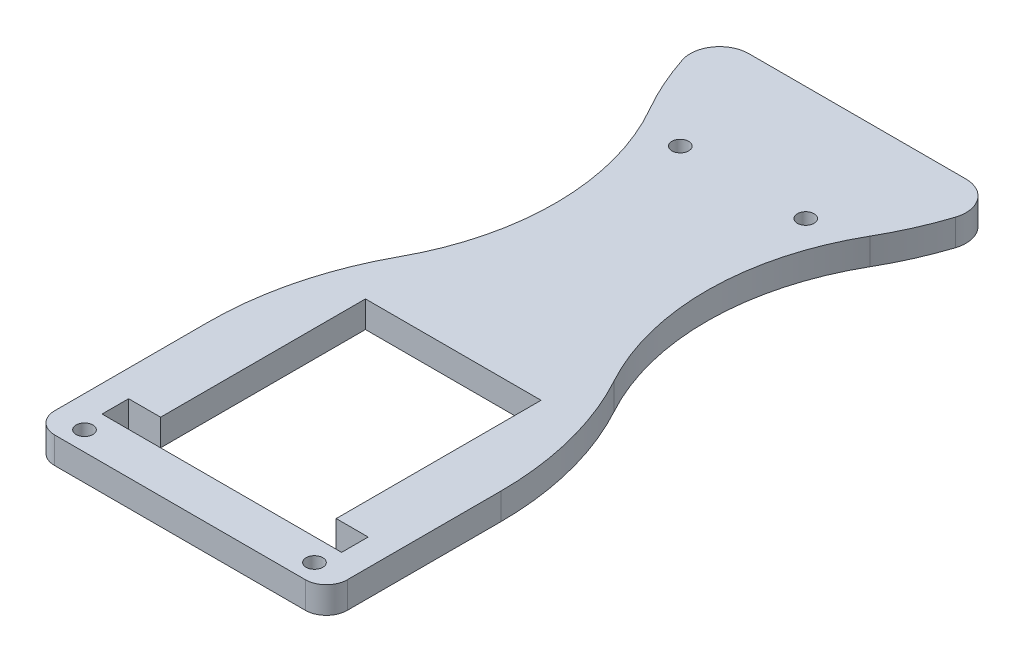
ISO-10303-21;
HEADER;
FILE_DESCRIPTION(('STEP AP214'),'2;1');
FILE_NAME('part.step','',(''),(''),'','','');
FILE_SCHEMA(('AUTOMOTIVE_DESIGN { 1 0 10303 214 1 1 1 1 }'));
ENDSEC;
DATA;
#1=APPLICATION_CONTEXT('core data for automotive mechanical design processes');
#2=APPLICATION_PROTOCOL_DEFINITION('international standard','automotive_design',2000,#1);
#3=PRODUCT_CONTEXT('',#1,'mechanical');
#4=PRODUCT('Part','Part','',(#3));
#5=PRODUCT_RELATED_PRODUCT_CATEGORY('part','',(#4));
#6=PRODUCT_DEFINITION_FORMATION('','',#4);
#7=PRODUCT_DEFINITION_CONTEXT('part definition',#1,'design');
#8=PRODUCT_DEFINITION('design','',#6,#7);
#9=PRODUCT_DEFINITION_SHAPE('','',#8);
#10=(LENGTH_UNIT() NAMED_UNIT(*) SI_UNIT(.MILLI.,.METRE.));
#11=(NAMED_UNIT(*) PLANE_ANGLE_UNIT() SI_UNIT($,.RADIAN.));
#12=(NAMED_UNIT(*) SI_UNIT($,.STERADIAN.) SOLID_ANGLE_UNIT());
#13=UNCERTAINTY_MEASURE_WITH_UNIT(LENGTH_MEASURE(1.E-05),#10,'distance_accuracy_value','');
#14=(GEOMETRIC_REPRESENTATION_CONTEXT(3) GLOBAL_UNCERTAINTY_ASSIGNED_CONTEXT((#13)) GLOBAL_UNIT_ASSIGNED_CONTEXT((#10,
#11,#12)) REPRESENTATION_CONTEXT('',''));
#15=CARTESIAN_POINT('',(0.,0.,0.));
#16=DIRECTION('',(0.,0.,1.));
#17=DIRECTION('',(1.,0.,0.));
#18=AXIS2_PLACEMENT_3D('',#15,#16,#17);
#19=CARTESIAN_POINT('',(0.,3.175,0.));
#20=DIRECTION('',(0.,1.,0.));
#21=DIRECTION('',(0.,0.,1.));
#22=AXIS2_PLACEMENT_3D('',#19,#20,#21);
#23=PLANE('',#22);
#24=CARTESIAN_POINT('',(27.5,3.175,195.35));
#25=DIRECTION('',(0.,1.,0.));
#26=DIRECTION('',(0.,0.,1.));
#27=AXIS2_PLACEMENT_3D('',#24,#25,#26);
#28=CIRCLE('',#27,2.00000000000001);
#29=CARTESIAN_POINT('',(27.5,3.175,197.35));
#30=VERTEX_POINT('',#29);
#31=EDGE_CURVE('E463',#30,#30,#28,.T.);
#32=ORIENTED_EDGE('',*,*,#31,.F.);
#33=EDGE_LOOP('',(#32));
#34=FACE_BOUND('',#33,.T.);
#35=CARTESIAN_POINT('',(-15.,3.175,65.3500000000001));
#36=DIRECTION('',(0.,1.,0.));
#37=DIRECTION('',(0.,0.,1.));
#38=AXIS2_PLACEMENT_3D('',#35,#36,#37);
#39=CIRCLE('',#38,2.);
#40=CARTESIAN_POINT('',(-15.,3.175,67.3500000000001));
#41=VERTEX_POINT('',#40);
#42=EDGE_CURVE('E447',#41,#41,#39,.T.);
#43=ORIENTED_EDGE('',*,*,#42,.F.);
#44=EDGE_LOOP('',(#43));
#45=FACE_BOUND('',#44,.T.);
#46=CARTESIAN_POINT('',(15.,3.175,65.3500000000001));
#47=DIRECTION('',(0.,1.,0.));
#48=DIRECTION('',(0.,0.,1.));
#49=AXIS2_PLACEMENT_3D('',#46,#47,#48);
#50=CIRCLE('',#49,2.00000000000001);
#51=CARTESIAN_POINT('',(15.,3.175,67.3500000000001));
#52=VERTEX_POINT('',#51);
#53=EDGE_CURVE('E228',#52,#52,#50,.T.);
#54=ORIENTED_EDGE('',*,*,#53,.F.);
#55=EDGE_LOOP('',(#54));
#56=FACE_BOUND('',#55,.T.);
#57=CARTESIAN_POINT('',(-27.5,3.175,195.35));
#58=DIRECTION('',(0.,1.,0.));
#59=DIRECTION('',(0.,0.,1.));
#60=AXIS2_PLACEMENT_3D('',#57,#58,#59);
#61=CIRCLE('',#60,2.00000000000001);
#62=CARTESIAN_POINT('',(-27.5,3.175,197.35));
#63=VERTEX_POINT('',#62);
#64=EDGE_CURVE('E474',#63,#63,#61,.T.);
#65=ORIENTED_EDGE('',*,*,#64,.F.);
#66=EDGE_LOOP('',(#65));
#67=FACE_BOUND('',#66,.T.);
#68=DIRECTION('',(-1.,0.,0.));
#69=VECTOR('',#68,1.);
#70=CARTESIAN_POINT('',(0.,3.175,183.65));
#71=LINE('',#70,#69);
#72=CARTESIAN_POINT('',(-21.,3.175,183.65));
#73=VERTEX_POINT('',#72);
#74=CARTESIAN_POINT('',(-28.65,3.175,183.65));
#75=VERTEX_POINT('',#74);
#76=EDGE_CURVE('E250',#73,#75,#71,.T.);
#77=ORIENTED_EDGE('',*,*,#76,.F.);
#78=DIRECTION('',(0.,0.,-1.));
#79=VECTOR('',#78,1.);
#80=CARTESIAN_POINT('',(-21.,3.175,0.));
#81=LINE('',#80,#79);
#82=CARTESIAN_POINT('',(-21.,3.175,134.65));
#83=VERTEX_POINT('',#82);
#84=EDGE_CURVE('E198',#73,#83,#81,.T.);
#85=ORIENTED_EDGE('',*,*,#84,.T.);
#86=DIRECTION('',(-1.,0.,0.));
#87=VECTOR('',#86,1.);
#88=CARTESIAN_POINT('',(0.,3.175,134.65));
#89=LINE('',#88,#87);
#90=CARTESIAN_POINT('',(21.,3.175,134.65));
#91=VERTEX_POINT('',#90);
#92=EDGE_CURVE('E221',#91,#83,#89,.T.);
#93=ORIENTED_EDGE('',*,*,#92,.F.);
#94=DIRECTION('',(0.,0.,-1.));
#95=VECTOR('',#94,1.);
#96=CARTESIAN_POINT('',(21.,3.175,0.));
#97=LINE('',#96,#95);
#98=CARTESIAN_POINT('',(21.,3.175,183.65));
#99=VERTEX_POINT('',#98);
#100=EDGE_CURVE('E225',#99,#91,#97,.T.);
#101=ORIENTED_EDGE('',*,*,#100,.F.);
#102=DIRECTION('',(1.,0.,0.));
#103=VECTOR('',#102,1.);
#104=CARTESIAN_POINT('',(0.,3.175,183.65));
#105=LINE('',#104,#103);
#106=CARTESIAN_POINT('',(28.65,3.175,183.65));
#107=VERTEX_POINT('',#106);
#108=EDGE_CURVE('E266',#99,#107,#105,.T.);
#109=ORIENTED_EDGE('',*,*,#108,.T.);
#110=DIRECTION('',(0.,0.,-1.));
#111=VECTOR('',#110,1.);
#112=CARTESIAN_POINT('',(28.65,3.175,0.));
#113=LINE('',#112,#111);
#114=CARTESIAN_POINT('',(28.65,3.175,190.));
#115=VERTEX_POINT('',#114);
#116=EDGE_CURVE('E262',#115,#107,#113,.T.);
#117=ORIENTED_EDGE('',*,*,#116,.F.);
#118=DIRECTION('',(-1.,0.,0.));
#119=VECTOR('',#118,1.);
#120=CARTESIAN_POINT('',(0.,3.175,190.));
#121=LINE('',#120,#119);
#122=CARTESIAN_POINT('',(-28.65,3.175,190.));
#123=VERTEX_POINT('',#122);
#124=EDGE_CURVE('E258',#115,#123,#121,.T.);
#125=ORIENTED_EDGE('',*,*,#124,.T.);
#126=DIRECTION('',(0.,0.,-1.));
#127=VECTOR('',#126,1.);
#128=CARTESIAN_POINT('',(-28.65,3.175,0.));
#129=LINE('',#128,#127);
#130=EDGE_CURVE('E254',#123,#75,#129,.T.);
#131=ORIENTED_EDGE('',*,*,#130,.T.);
#132=EDGE_LOOP('',(#77,#85,#93,#101,#109,#117,#125,#131));
#133=FACE_BOUND('',#132,.T.);
#134=CARTESIAN_POINT('',(-39.608915366642,3.175,23.5255484451654));
#135=DIRECTION('',(0.,1.,0.));
#136=DIRECTION('',(0.,0.,1.));
#137=AXIS2_PLACEMENT_3D('',#134,#135,#136);
#138=CIRCLE('',#137,76.);
#139=CARTESIAN_POINT('',(26.311818964941,3.175,61.3469284462291));
#140=VERTEX_POINT('',#139);
#141=CARTESIAN_POINT('',(32.6166665782042,3.175,47.1785675490412));
#142=VERTEX_POINT('',#141);
#143=EDGE_CURVE('E366',#140,#142,#138,.T.);
#144=ORIENTED_EDGE('',*,*,#143,.T.);
#145=CARTESIAN_POINT('',(25.964310346442,3.175,45.));
#146=DIRECTION('',(0.,1.,0.));
#147=DIRECTION('',(0.,0.,1.));
#148=AXIS2_PLACEMENT_3D('',#145,#146,#147);
#149=CIRCLE('',#148,7.);
#150=CARTESIAN_POINT('',(25.964310346442,3.175,38.));
#151=VERTEX_POINT('',#150);
#152=EDGE_CURVE('E403',#142,#151,#149,.T.);
#153=ORIENTED_EDGE('',*,*,#152,.T.);
#154=DIRECTION('',(-1.,0.,0.));
#155=VECTOR('',#154,1.);
#156=CARTESIAN_POINT('',(0.,3.175,38.));
#157=LINE('',#156,#155);
#158=CARTESIAN_POINT('',(-25.9643103464421,3.175,38.));
#159=VERTEX_POINT('',#158);
#160=EDGE_CURVE('E276',#151,#159,#157,.T.);
#161=ORIENTED_EDGE('',*,*,#160,.T.);
#162=CARTESIAN_POINT('',(-25.964310346442,3.175,45.));
#163=DIRECTION('',(0.,1.,0.));
#164=DIRECTION('',(0.,0.,1.));
#165=AXIS2_PLACEMENT_3D('',#162,#163,#164);
#166=CIRCLE('',#165,7.);
#167=CARTESIAN_POINT('',(-32.6166665782042,3.175,47.1785675490412));
#168=VERTEX_POINT('',#167);
#169=EDGE_CURVE('E400',#159,#168,#166,.T.);
#170=ORIENTED_EDGE('',*,*,#169,.T.);
#171=CARTESIAN_POINT('',(39.608915366642,3.175,23.5255484451655));
#172=DIRECTION('',(0.,1.,0.));
#173=DIRECTION('',(0.,0.,1.));
#174=AXIS2_PLACEMENT_3D('',#171,#172,#173);
#175=CIRCLE('',#174,76.);
#176=CARTESIAN_POINT('',(-26.311818964941,3.175,61.3469284462291));
#177=VERTEX_POINT('',#176);
#178=EDGE_CURVE('E360',#168,#177,#175,.T.);
#179=ORIENTED_EDGE('',*,*,#178,.T.);
#180=CARTESIAN_POINT('',(-80.,3.175,92.15));
#181=DIRECTION('',(0.,1.,0.));
#182=DIRECTION('',(0.,0.,1.));
#183=AXIS2_PLACEMENT_3D('',#180,#181,#182);
#184=CIRCLE('',#183,61.8970920156997);
#185=CARTESIAN_POINT('',(-25.6874106304796,3.175,121.838257543646));
#186=VERTEX_POINT('',#185);
#187=EDGE_CURVE('E443',#186,#177,#184,.T.);
#188=ORIENTED_EDGE('',*,*,#187,.F.);
#189=CARTESIAN_POINT('',(41.,3.175,158.290819365853));
#190=DIRECTION('',(0.,1.,0.));
#191=DIRECTION('',(0.,0.,1.));
#192=AXIS2_PLACEMENT_3D('',#189,#190,#191);
#193=CIRCLE('',#192,76.);
#194=CARTESIAN_POINT('',(-35.,3.175,158.290819365853));
#195=VERTEX_POINT('',#194);
#196=EDGE_CURVE('E357',#186,#195,#193,.T.);
#197=ORIENTED_EDGE('',*,*,#196,.T.);
#198=DIRECTION('',(0.,0.,1.));
#199=VECTOR('',#198,1.);
#200=CARTESIAN_POINT('',(-35.,3.175,0.));
#201=LINE('',#200,#199);
#202=CARTESIAN_POINT('',(-35.,3.175,195.));
#203=VERTEX_POINT('',#202);
#204=EDGE_CURVE('E301',#195,#203,#201,.T.);
#205=ORIENTED_EDGE('',*,*,#204,.T.);
#206=CARTESIAN_POINT('',(-30.,3.175,195.));
#207=DIRECTION('',(0.,1.,0.));
#208=DIRECTION('',(0.,0.,1.));
#209=AXIS2_PLACEMENT_3D('',#206,#207,#208);
#210=CIRCLE('',#209,5.);
#211=CARTESIAN_POINT('',(-30.,3.175,200.));
#212=VERTEX_POINT('',#211);
#213=EDGE_CURVE('E340',#203,#212,#210,.T.);
#214=ORIENTED_EDGE('',*,*,#213,.T.);
#215=DIRECTION('',(1.,0.,0.));
#216=VECTOR('',#215,1.);
#217=CARTESIAN_POINT('',(0.,3.175,200.));
#218=LINE('',#217,#216);
#219=CARTESIAN_POINT('',(30.,3.175,200.));
#220=VERTEX_POINT('',#219);
#221=EDGE_CURVE('E304',#212,#220,#218,.T.);
#222=ORIENTED_EDGE('',*,*,#221,.T.);
#223=CARTESIAN_POINT('',(30.,3.175,195.));
#224=DIRECTION('',(0.,1.,0.));
#225=DIRECTION('',(0.,0.,1.));
#226=AXIS2_PLACEMENT_3D('',#223,#224,#225);
#227=CIRCLE('',#226,5.);
#228=CARTESIAN_POINT('',(35.,3.175,195.));
#229=VERTEX_POINT('',#228);
#230=EDGE_CURVE('E343',#220,#229,#227,.T.);
#231=ORIENTED_EDGE('',*,*,#230,.T.);
#232=DIRECTION('',(0.,0.,-1.));
#233=VECTOR('',#232,1.);
#234=CARTESIAN_POINT('',(35.,3.175,0.));
#235=LINE('',#234,#233);
#236=CARTESIAN_POINT('',(35.,3.175,158.290819365853));
#237=VERTEX_POINT('',#236);
#238=EDGE_CURVE('E309',#229,#237,#235,.T.);
#239=ORIENTED_EDGE('',*,*,#238,.T.);
#240=CARTESIAN_POINT('',(-41.,3.175,158.290819365853));
#241=DIRECTION('',(0.,1.,0.));
#242=DIRECTION('',(0.,0.,1.));
#243=AXIS2_PLACEMENT_3D('',#240,#241,#242);
#244=CIRCLE('',#243,76.);
#245=CARTESIAN_POINT('',(25.6874106304796,3.175,121.838257543646));
#246=VERTEX_POINT('',#245);
#247=EDGE_CURVE('E363',#237,#246,#244,.T.);
#248=ORIENTED_EDGE('',*,*,#247,.T.);
#249=CARTESIAN_POINT('',(80.,3.175,92.15));
#250=DIRECTION('',(0.,-1.,0.));
#251=DIRECTION('',(0.,0.,1.));
#252=AXIS2_PLACEMENT_3D('',#249,#250,#251);
#253=CIRCLE('',#252,61.8970920156997);
#254=EDGE_CURVE('E457',#246,#140,#253,.T.);
#255=ORIENTED_EDGE('',*,*,#254,.T.);
#256=EDGE_LOOP('',(#144,#153,#161,#170,#179,#188,#197,#205,#214,#222,#231,#239,#248,#255));
#257=FACE_BOUND('',#256,.T.);
#258=ADVANCED_FACE('F41',(#34,#45,#56,#67,#133,#257),#23,.T.);
#259=CARTESIAN_POINT('',(0.,-3.175,0.));
#260=DIRECTION('',(0.,1.,0.));
#261=DIRECTION('',(0.,0.,1.));
#262=AXIS2_PLACEMENT_3D('',#259,#260,#261);
#263=PLANE('',#262);
#264=DIRECTION('',(0.,0.,-1.));
#265=VECTOR('',#264,1.);
#266=CARTESIAN_POINT('',(-21.,-3.175,0.));
#267=LINE('',#266,#265);
#268=CARTESIAN_POINT('',(-21.,-3.175,183.65));
#269=VERTEX_POINT('',#268);
#270=CARTESIAN_POINT('',(-21.,-3.175,134.65));
#271=VERTEX_POINT('',#270);
#272=EDGE_CURVE('E195',#269,#271,#267,.T.);
#273=ORIENTED_EDGE('',*,*,#272,.F.);
#274=DIRECTION('',(-1.,0.,0.));
#275=VECTOR('',#274,1.);
#276=CARTESIAN_POINT('',(0.,-3.175,183.65));
#277=LINE('',#276,#275);
#278=CARTESIAN_POINT('',(-28.65,-3.175,183.65));
#279=VERTEX_POINT('',#278);
#280=EDGE_CURVE('E207',#269,#279,#277,.T.);
#281=ORIENTED_EDGE('',*,*,#280,.T.);
#282=DIRECTION('',(0.,0.,-1.));
#283=VECTOR('',#282,1.);
#284=CARTESIAN_POINT('',(-28.65,-3.175,0.));
#285=LINE('',#284,#283);
#286=CARTESIAN_POINT('',(-28.65,-3.175,190.));
#287=VERTEX_POINT('',#286);
#288=EDGE_CURVE('E213',#287,#279,#285,.T.);
#289=ORIENTED_EDGE('',*,*,#288,.F.);
#290=DIRECTION('',(-1.,0.,0.));
#291=VECTOR('',#290,1.);
#292=CARTESIAN_POINT('',(0.,-3.175,190.));
#293=LINE('',#292,#291);
#294=CARTESIAN_POINT('',(28.65,-3.175,190.));
#295=VERTEX_POINT('',#294);
#296=EDGE_CURVE('E233',#295,#287,#293,.T.);
#297=ORIENTED_EDGE('',*,*,#296,.F.);
#298=DIRECTION('',(0.,0.,-1.));
#299=VECTOR('',#298,1.);
#300=CARTESIAN_POINT('',(28.65,-3.175,0.));
#301=LINE('',#300,#299);
#302=CARTESIAN_POINT('',(28.65,-3.175,183.65));
#303=VERTEX_POINT('',#302);
#304=EDGE_CURVE('E236',#295,#303,#301,.T.);
#305=ORIENTED_EDGE('',*,*,#304,.T.);
#306=DIRECTION('',(1.,0.,0.));
#307=VECTOR('',#306,1.);
#308=CARTESIAN_POINT('',(0.,-3.175,183.65));
#309=LINE('',#308,#307);
#310=CARTESIAN_POINT('',(21.,-3.175,183.65));
#311=VERTEX_POINT('',#310);
#312=EDGE_CURVE('E240',#311,#303,#309,.T.);
#313=ORIENTED_EDGE('',*,*,#312,.F.);
#314=DIRECTION('',(0.,0.,-1.));
#315=VECTOR('',#314,1.);
#316=CARTESIAN_POINT('',(21.,-3.175,0.));
#317=LINE('',#316,#315);
#318=CARTESIAN_POINT('',(21.,-3.175,134.65));
#319=VERTEX_POINT('',#318);
#320=EDGE_CURVE('E243',#311,#319,#317,.T.);
#321=ORIENTED_EDGE('',*,*,#320,.T.);
#322=DIRECTION('',(-1.,0.,0.));
#323=VECTOR('',#322,1.);
#324=CARTESIAN_POINT('',(0.,-3.175,134.65));
#325=LINE('',#324,#323);
#326=EDGE_CURVE('E204',#319,#271,#325,.T.);
#327=ORIENTED_EDGE('',*,*,#326,.T.);
#328=EDGE_LOOP('',(#273,#281,#289,#297,#305,#313,#321,#327));
#329=FACE_BOUND('',#328,.T.);
#330=CARTESIAN_POINT('',(-27.5,-3.175,195.35));
#331=DIRECTION('',(0.,1.,0.));
#332=DIRECTION('',(0.,0.,1.));
#333=AXIS2_PLACEMENT_3D('',#330,#331,#332);
#334=CIRCLE('',#333,2.00000000000001);
#335=CARTESIAN_POINT('',(-27.5,-3.175,197.35));
#336=VERTEX_POINT('',#335);
#337=EDGE_CURVE('E467',#336,#336,#334,.T.);
#338=ORIENTED_EDGE('',*,*,#337,.T.);
#339=EDGE_LOOP('',(#338));
#340=FACE_BOUND('',#339,.T.);
#341=CARTESIAN_POINT('',(15.,-3.175,65.3500000000001));
#342=DIRECTION('',(0.,1.,0.));
#343=DIRECTION('',(0.,0.,1.));
#344=AXIS2_PLACEMENT_3D('',#341,#342,#343);
#345=CIRCLE('',#344,2.00000000000001);
#346=CARTESIAN_POINT('',(15.,-3.175,67.3500000000001));
#347=VERTEX_POINT('',#346);
#348=EDGE_CURVE('E477',#347,#347,#345,.T.);
#349=ORIENTED_EDGE('',*,*,#348,.T.);
#350=EDGE_LOOP('',(#349));
#351=FACE_BOUND('',#350,.T.);
#352=CARTESIAN_POINT('',(-15.,-3.175,65.3500000000001));
#353=DIRECTION('',(0.,1.,0.));
#354=DIRECTION('',(0.,0.,1.));
#355=AXIS2_PLACEMENT_3D('',#352,#353,#354);
#356=CIRCLE('',#355,2.);
#357=CARTESIAN_POINT('',(-15.,-3.175,67.3500000000001));
#358=VERTEX_POINT('',#357);
#359=EDGE_CURVE('E452',#358,#358,#356,.T.);
#360=ORIENTED_EDGE('',*,*,#359,.T.);
#361=EDGE_LOOP('',(#360));
#362=FACE_BOUND('',#361,.T.);
#363=CARTESIAN_POINT('',(27.5,-3.175,195.35));
#364=DIRECTION('',(0.,1.,0.));
#365=DIRECTION('',(0.,0.,1.));
#366=AXIS2_PLACEMENT_3D('',#363,#364,#365);
#367=CIRCLE('',#366,2.00000000000001);
#368=CARTESIAN_POINT('',(27.5,-3.175,197.35));
#369=VERTEX_POINT('',#368);
#370=EDGE_CURVE('E251',#369,#369,#367,.T.);
#371=ORIENTED_EDGE('',*,*,#370,.T.);
#372=EDGE_LOOP('',(#371));
#373=FACE_BOUND('',#372,.T.);
#374=DIRECTION('',(-1.,0.,0.));
#375=VECTOR('',#374,1.);
#376=CARTESIAN_POINT('',(0.,-3.175,38.));
#377=LINE('',#376,#375);
#378=CARTESIAN_POINT('',(25.964310346442,-3.175,38.));
#379=VERTEX_POINT('',#378);
#380=CARTESIAN_POINT('',(-25.9643103464421,-3.175,38.));
#381=VERTEX_POINT('',#380);
#382=EDGE_CURVE('E294',#379,#381,#377,.T.);
#383=ORIENTED_EDGE('',*,*,#382,.F.);
#384=CARTESIAN_POINT('',(25.964310346442,-3.175,45.));
#385=DIRECTION('',(0.,1.,0.));
#386=DIRECTION('',(0.,0.,1.));
#387=AXIS2_PLACEMENT_3D('',#384,#385,#386);
#388=CIRCLE('',#387,7.);
#389=CARTESIAN_POINT('',(32.6166665782042,-3.175,47.1785675490412));
#390=VERTEX_POINT('',#389);
#391=EDGE_CURVE('E50',#379,#390,#388,.F.);
#392=ORIENTED_EDGE('',*,*,#391,.T.);
#393=CARTESIAN_POINT('',(-39.608915366642,-3.175,23.5255484451654));
#394=DIRECTION('',(0.,1.,0.));
#395=DIRECTION('',(0.,0.,1.));
#396=AXIS2_PLACEMENT_3D('',#393,#394,#395);
#397=CIRCLE('',#396,76.);
#398=CARTESIAN_POINT('',(26.311818964941,-3.175,61.3469284462291));
#399=VERTEX_POINT('',#398);
#400=EDGE_CURVE('E379',#390,#399,#397,.F.);
#401=ORIENTED_EDGE('',*,*,#400,.T.);
#402=CARTESIAN_POINT('',(80.,-3.175,92.15));
#403=DIRECTION('',(0.,-1.,0.));
#404=DIRECTION('',(0.,0.,1.));
#405=AXIS2_PLACEMENT_3D('',#402,#403,#404);
#406=CIRCLE('',#405,61.8970920156997);
#407=CARTESIAN_POINT('',(25.6874106304796,-3.175,121.838257543646));
#408=VERTEX_POINT('',#407);
#409=EDGE_CURVE('E454',#408,#399,#406,.T.);
#410=ORIENTED_EDGE('',*,*,#409,.F.);
#411=CARTESIAN_POINT('',(-41.,-3.175,158.290819365853));
#412=DIRECTION('',(0.,1.,0.));
#413=DIRECTION('',(0.,0.,1.));
#414=AXIS2_PLACEMENT_3D('',#411,#412,#413);
#415=CIRCLE('',#414,76.);
#416=CARTESIAN_POINT('',(35.,-3.175,158.290819365853));
#417=VERTEX_POINT('',#416);
#418=EDGE_CURVE('E376',#408,#417,#415,.F.);
#419=ORIENTED_EDGE('',*,*,#418,.T.);
#420=DIRECTION('',(0.,0.,-1.));
#421=VECTOR('',#420,1.);
#422=CARTESIAN_POINT('',(35.,-3.175,0.));
#423=LINE('',#422,#421);
#424=CARTESIAN_POINT('',(35.,-3.175,195.));
#425=VERTEX_POINT('',#424);
#426=EDGE_CURVE('E305',#425,#417,#423,.T.);
#427=ORIENTED_EDGE('',*,*,#426,.F.);
#428=CARTESIAN_POINT('',(30.,-3.175,195.));
#429=DIRECTION('',(0.,1.,0.));
#430=DIRECTION('',(0.,0.,1.));
#431=AXIS2_PLACEMENT_3D('',#428,#429,#430);
#432=CIRCLE('',#431,5.);
#433=CARTESIAN_POINT('',(30.,-3.175,200.));
#434=VERTEX_POINT('',#433);
#435=EDGE_CURVE('E330',#425,#434,#432,.F.);
#436=ORIENTED_EDGE('',*,*,#435,.T.);
#437=DIRECTION('',(1.,0.,0.));
#438=VECTOR('',#437,1.);
#439=CARTESIAN_POINT('',(0.,-3.175,200.));
#440=LINE('',#439,#438);
#441=CARTESIAN_POINT('',(-30.,-3.175,200.));
#442=VERTEX_POINT('',#441);
#443=EDGE_CURVE('E316',#442,#434,#440,.T.);
#444=ORIENTED_EDGE('',*,*,#443,.F.);
#445=CARTESIAN_POINT('',(-30.,-3.175,195.));
#446=DIRECTION('',(0.,1.,0.));
#447=DIRECTION('',(0.,0.,1.));
#448=AXIS2_PLACEMENT_3D('',#445,#446,#447);
#449=CIRCLE('',#448,5.);
#450=CARTESIAN_POINT('',(-35.,-3.175,195.));
#451=VERTEX_POINT('',#450);
#452=EDGE_CURVE('E326',#442,#451,#449,.F.);
#453=ORIENTED_EDGE('',*,*,#452,.T.);
#454=DIRECTION('',(0.,0.,1.));
#455=VECTOR('',#454,1.);
#456=CARTESIAN_POINT('',(-35.,-3.175,0.));
#457=LINE('',#456,#455);
#458=CARTESIAN_POINT('',(-35.,-3.175,158.290819365853));
#459=VERTEX_POINT('',#458);
#460=EDGE_CURVE('E297',#459,#451,#457,.T.);
#461=ORIENTED_EDGE('',*,*,#460,.F.);
#462=CARTESIAN_POINT('',(41.,-3.175,158.290819365853));
#463=DIRECTION('',(0.,1.,0.));
#464=DIRECTION('',(0.,0.,1.));
#465=AXIS2_PLACEMENT_3D('',#462,#463,#464);
#466=CIRCLE('',#465,76.);
#467=CARTESIAN_POINT('',(-25.6874106304796,-3.175,121.838257543646));
#468=VERTEX_POINT('',#467);
#469=EDGE_CURVE('E370',#459,#468,#466,.F.);
#470=ORIENTED_EDGE('',*,*,#469,.T.);
#471=CARTESIAN_POINT('',(-80.,-3.175,92.15));
#472=DIRECTION('',(0.,1.,0.));
#473=DIRECTION('',(0.,0.,1.));
#474=AXIS2_PLACEMENT_3D('',#471,#472,#473);
#475=CIRCLE('',#474,61.8970920156997);
#476=CARTESIAN_POINT('',(-26.311818964941,-3.175,61.3469284462291));
#477=VERTEX_POINT('',#476);
#478=EDGE_CURVE('E441',#468,#477,#475,.T.);
#479=ORIENTED_EDGE('',*,*,#478,.T.);
#480=CARTESIAN_POINT('',(39.608915366642,-3.175,23.5255484451655));
#481=DIRECTION('',(0.,1.,0.));
#482=DIRECTION('',(0.,0.,1.));
#483=AXIS2_PLACEMENT_3D('',#480,#481,#482);
#484=CIRCLE('',#483,76.);
#485=CARTESIAN_POINT('',(-32.6166665782042,-3.175,47.1785675490412));
#486=VERTEX_POINT('',#485);
#487=EDGE_CURVE('E373',#477,#486,#484,.F.);
#488=ORIENTED_EDGE('',*,*,#487,.T.);
#489=CARTESIAN_POINT('',(-25.964310346442,-3.175,45.));
#490=DIRECTION('',(0.,1.,0.));
#491=DIRECTION('',(0.,0.,1.));
#492=AXIS2_PLACEMENT_3D('',#489,#490,#491);
#493=CIRCLE('',#492,7.);
#494=EDGE_CURVE('E62',#486,#381,#493,.F.);
#495=ORIENTED_EDGE('',*,*,#494,.T.);
#496=EDGE_LOOP('',(#383,#392,#401,#410,#419,#427,#436,#444,#453,#461,#470,#479,#488,#495));
#497=FACE_BOUND('',#496,.T.);
#498=ADVANCED_FACE('F216',(#329,#340,#351,#362,#373,#497),#263,.F.);
#499=CARTESIAN_POINT('',(35.,3.175,0.));
#500=DIRECTION('',(-1.,0.,0.));
#501=DIRECTION('',(0.,0.,1.));
#502=AXIS2_PLACEMENT_3D('',#499,#500,#501);
#503=PLANE('',#502);
#504=ORIENTED_EDGE('',*,*,#426,.T.);
#505=DIRECTION('',(0.,-1.,0.));
#506=VECTOR('',#505,1.);
#507=CARTESIAN_POINT('',(35.,3.175,158.290819365853));
#508=LINE('',#507,#506);
#509=EDGE_CURVE('E382',#417,#237,#508,.F.);
#510=ORIENTED_EDGE('',*,*,#509,.T.);
#511=ORIENTED_EDGE('',*,*,#238,.F.);
#512=DIRECTION('',(0.,-1.,0.));
#513=VECTOR('',#512,1.);
#514=CARTESIAN_POINT('',(35.,3.175,195.));
#515=LINE('',#514,#513);
#516=EDGE_CURVE('E313',#229,#425,#515,.T.);
#517=ORIENTED_EDGE('',*,*,#516,.T.);
#518=EDGE_LOOP('',(#504,#510,#511,#517));
#519=FACE_BOUND('',#518,.T.);
#520=ADVANCED_FACE('F545',(#519),#503,.F.);
#521=CARTESIAN_POINT('',(-35.,3.175,0.));
#522=DIRECTION('',(1.,0.,0.));
#523=DIRECTION('',(0.,0.,-1.));
#524=AXIS2_PLACEMENT_3D('',#521,#522,#523);
#525=PLANE('',#524);
#526=ORIENTED_EDGE('',*,*,#204,.F.);
#527=DIRECTION('',(0.,1.,0.));
#528=VECTOR('',#527,1.);
#529=CARTESIAN_POINT('',(-35.,3.175,158.290819365853));
#530=LINE('',#529,#528);
#531=EDGE_CURVE('E393',#195,#459,#530,.F.);
#532=ORIENTED_EDGE('',*,*,#531,.T.);
#533=ORIENTED_EDGE('',*,*,#460,.T.);
#534=DIRECTION('',(0.,-1.,0.));
#535=VECTOR('',#534,1.);
#536=CARTESIAN_POINT('',(-35.,3.175,195.));
#537=LINE('',#536,#535);
#538=EDGE_CURVE('E346',#451,#203,#537,.F.);
#539=ORIENTED_EDGE('',*,*,#538,.T.);
#540=EDGE_LOOP('',(#526,#532,#533,#539));
#541=FACE_BOUND('',#540,.T.);
#542=ADVANCED_FACE('F548',(#541),#525,.F.);
#543=CARTESIAN_POINT('',(0.,3.175,200.));
#544=DIRECTION('',(0.,0.,-1.));
#545=DIRECTION('',(-1.,0.,0.));
#546=AXIS2_PLACEMENT_3D('',#543,#544,#545);
#547=PLANE('',#546);
#548=ORIENTED_EDGE('',*,*,#443,.T.);
#549=DIRECTION('',(0.,-1.,0.));
#550=VECTOR('',#549,1.);
#551=CARTESIAN_POINT('',(30.,3.175,200.));
#552=LINE('',#551,#550);
#553=EDGE_CURVE('E337',#434,#220,#552,.F.);
#554=ORIENTED_EDGE('',*,*,#553,.T.);
#555=ORIENTED_EDGE('',*,*,#221,.F.);
#556=DIRECTION('',(0.,-1.,0.));
#557=VECTOR('',#556,1.);
#558=CARTESIAN_POINT('',(-30.,3.175,200.));
#559=LINE('',#558,#557);
#560=EDGE_CURVE('E333',#212,#442,#559,.T.);
#561=ORIENTED_EDGE('',*,*,#560,.T.);
#562=EDGE_LOOP('',(#548,#554,#555,#561));
#563=FACE_BOUND('',#562,.T.);
#564=ADVANCED_FACE('F541',(#563),#547,.F.);
#565=CARTESIAN_POINT('',(0.,-3.175,38.));
#566=DIRECTION('',(0.,0.,-1.));
#567=DIRECTION('',(-1.,0.,0.));
#568=AXIS2_PLACEMENT_3D('',#565,#566,#567);
#569=PLANE('',#568);
#570=ORIENTED_EDGE('',*,*,#160,.F.);
#571=DIRECTION('',(0.,1.,0.));
#572=VECTOR('',#571,1.);
#573=CARTESIAN_POINT('',(25.964310346442,-3.175,38.));
#574=LINE('',#573,#572);
#575=EDGE_CURVE('E410',#151,#379,#574,.F.);
#576=ORIENTED_EDGE('',*,*,#575,.T.);
#577=ORIENTED_EDGE('',*,*,#382,.T.);
#578=DIRECTION('',(0.,1.,0.));
#579=VECTOR('',#578,1.);
#580=CARTESIAN_POINT('',(-25.9643103464421,-3.175,38.));
#581=LINE('',#580,#579);
#582=EDGE_CURVE('E406',#381,#159,#581,.T.);
#583=ORIENTED_EDGE('',*,*,#582,.T.);
#584=EDGE_LOOP('',(#570,#576,#577,#583));
#585=FACE_BOUND('',#584,.T.);
#586=ADVANCED_FACE('F430',(#585),#569,.T.);
#587=CARTESIAN_POINT('',(-21.,-3.175,0.));
#588=DIRECTION('',(1.,0.,0.));
#589=DIRECTION('',(0.,0.,-1.));
#590=AXIS2_PLACEMENT_3D('',#587,#588,#589);
#591=PLANE('',#590);
#592=ORIENTED_EDGE('',*,*,#84,.F.);
#593=DIRECTION('',(0.,1.,0.));
#594=VECTOR('',#593,1.);
#595=CARTESIAN_POINT('',(-21.,-3.175,183.65));
#596=LINE('',#595,#594);
#597=EDGE_CURVE('E191',#269,#73,#596,.T.);
#598=ORIENTED_EDGE('',*,*,#597,.F.);
#599=ORIENTED_EDGE('',*,*,#272,.T.);
#600=DIRECTION('',(0.,1.,0.));
#601=VECTOR('',#600,1.);
#602=CARTESIAN_POINT('',(-21.,-3.175,134.65));
#603=LINE('',#602,#601);
#604=EDGE_CURVE('E273',#271,#83,#603,.T.);
#605=ORIENTED_EDGE('',*,*,#604,.T.);
#606=EDGE_LOOP('',(#592,#598,#599,#605));
#607=FACE_BOUND('',#606,.T.);
#608=ADVANCED_FACE('F193',(#607),#591,.T.);
#609=CARTESIAN_POINT('',(0.,-3.175,134.65));
#610=DIRECTION('',(0.,0.,-1.));
#611=DIRECTION('',(-1.,0.,0.));
#612=AXIS2_PLACEMENT_3D('',#609,#610,#611);
#613=PLANE('',#612);
#614=ORIENTED_EDGE('',*,*,#92,.T.);
#615=ORIENTED_EDGE('',*,*,#604,.F.);
#616=ORIENTED_EDGE('',*,*,#326,.F.);
#617=DIRECTION('',(0.,1.,0.));
#618=VECTOR('',#617,1.);
#619=CARTESIAN_POINT('',(21.,-3.175,134.65));
#620=LINE('',#619,#618);
#621=EDGE_CURVE('E277',#319,#91,#620,.T.);
#622=ORIENTED_EDGE('',*,*,#621,.T.);
#623=EDGE_LOOP('',(#614,#615,#616,#622));
#624=FACE_BOUND('',#623,.T.);
#625=ADVANCED_FACE('F517',(#624),#613,.F.);
#626=CARTESIAN_POINT('',(21.,-3.175,0.));
#627=DIRECTION('',(1.,0.,0.));
#628=DIRECTION('',(0.,0.,-1.));
#629=AXIS2_PLACEMENT_3D('',#626,#627,#628);
#630=PLANE('',#629);
#631=ORIENTED_EDGE('',*,*,#100,.T.);
#632=ORIENTED_EDGE('',*,*,#621,.F.);
#633=ORIENTED_EDGE('',*,*,#320,.F.);
#634=DIRECTION('',(0.,1.,0.));
#635=VECTOR('',#634,1.);
#636=CARTESIAN_POINT('',(21.,-3.175,183.65));
#637=LINE('',#636,#635);
#638=EDGE_CURVE('E280',#311,#99,#637,.T.);
#639=ORIENTED_EDGE('',*,*,#638,.T.);
#640=EDGE_LOOP('',(#631,#632,#633,#639));
#641=FACE_BOUND('',#640,.T.);
#642=ADVANCED_FACE('F515',(#641),#630,.F.);
#643=CARTESIAN_POINT('',(0.,-3.175,183.65));
#644=DIRECTION('',(0.,0.,1.));
#645=DIRECTION('',(1.,0.,0.));
#646=AXIS2_PLACEMENT_3D('',#643,#644,#645);
#647=PLANE('',#646);
#648=ORIENTED_EDGE('',*,*,#108,.F.);
#649=ORIENTED_EDGE('',*,*,#638,.F.);
#650=ORIENTED_EDGE('',*,*,#312,.T.);
#651=DIRECTION('',(0.,1.,0.));
#652=VECTOR('',#651,1.);
#653=CARTESIAN_POINT('',(28.65,-3.175,183.65));
#654=LINE('',#653,#652);
#655=EDGE_CURVE('E283',#303,#107,#654,.T.);
#656=ORIENTED_EDGE('',*,*,#655,.T.);
#657=EDGE_LOOP('',(#648,#649,#650,#656));
#658=FACE_BOUND('',#657,.T.);
#659=ADVANCED_FACE('F511',(#658),#647,.T.);
#660=CARTESIAN_POINT('',(28.65,-3.175,0.));
#661=DIRECTION('',(1.,0.,0.));
#662=DIRECTION('',(0.,0.,-1.));
#663=AXIS2_PLACEMENT_3D('',#660,#661,#662);
#664=PLANE('',#663);
#665=ORIENTED_EDGE('',*,*,#116,.T.);
#666=ORIENTED_EDGE('',*,*,#655,.F.);
#667=ORIENTED_EDGE('',*,*,#304,.F.);
#668=DIRECTION('',(0.,1.,0.));
#669=VECTOR('',#668,1.);
#670=CARTESIAN_POINT('',(28.65,-3.175,190.));
#671=LINE('',#670,#669);
#672=EDGE_CURVE('E286',#295,#115,#671,.T.);
#673=ORIENTED_EDGE('',*,*,#672,.T.);
#674=EDGE_LOOP('',(#665,#666,#667,#673));
#675=FACE_BOUND('',#674,.T.);
#676=ADVANCED_FACE('F508',(#675),#664,.F.);
#677=CARTESIAN_POINT('',(0.,-3.175,190.));
#678=DIRECTION('',(0.,0.,-1.));
#679=DIRECTION('',(-1.,0.,0.));
#680=AXIS2_PLACEMENT_3D('',#677,#678,#679);
#681=PLANE('',#680);
#682=ORIENTED_EDGE('',*,*,#124,.F.);
#683=ORIENTED_EDGE('',*,*,#672,.F.);
#684=ORIENTED_EDGE('',*,*,#296,.T.);
#685=DIRECTION('',(0.,1.,0.));
#686=VECTOR('',#685,1.);
#687=CARTESIAN_POINT('',(-28.65,-3.175,190.));
#688=LINE('',#687,#686);
#689=EDGE_CURVE('E289',#287,#123,#688,.T.);
#690=ORIENTED_EDGE('',*,*,#689,.T.);
#691=EDGE_LOOP('',(#682,#683,#684,#690));
#692=FACE_BOUND('',#691,.T.);
#693=ADVANCED_FACE('F505',(#692),#681,.T.);
#694=CARTESIAN_POINT('',(-28.65,-3.175,0.));
#695=DIRECTION('',(1.,0.,0.));
#696=DIRECTION('',(0.,0.,-1.));
#697=AXIS2_PLACEMENT_3D('',#694,#695,#696);
#698=PLANE('',#697);
#699=ORIENTED_EDGE('',*,*,#130,.F.);
#700=ORIENTED_EDGE('',*,*,#689,.F.);
#701=ORIENTED_EDGE('',*,*,#288,.T.);
#702=DIRECTION('',(0.,1.,0.));
#703=VECTOR('',#702,1.);
#704=CARTESIAN_POINT('',(-28.65,-3.175,183.65));
#705=LINE('',#704,#703);
#706=EDGE_CURVE('E203',#279,#75,#705,.T.);
#707=ORIENTED_EDGE('',*,*,#706,.T.);
#708=EDGE_LOOP('',(#699,#700,#701,#707));
#709=FACE_BOUND('',#708,.T.);
#710=ADVANCED_FACE('F500',(#709),#698,.T.);
#711=CARTESIAN_POINT('',(0.,-3.175,183.65));
#712=DIRECTION('',(0.,0.,-1.));
#713=DIRECTION('',(-1.,0.,0.));
#714=AXIS2_PLACEMENT_3D('',#711,#712,#713);
#715=PLANE('',#714);
#716=ORIENTED_EDGE('',*,*,#76,.T.);
#717=ORIENTED_EDGE('',*,*,#706,.F.);
#718=ORIENTED_EDGE('',*,*,#280,.F.);
#719=ORIENTED_EDGE('',*,*,#597,.T.);
#720=EDGE_LOOP('',(#716,#717,#718,#719));
#721=FACE_BOUND('',#720,.T.);
#722=ADVANCED_FACE('F208',(#721),#715,.F.);
#723=CARTESIAN_POINT('',(30.,3.175,195.));
#724=DIRECTION('',(0.,-1.,0.));
#725=DIRECTION('',(0.,0.,-1.));
#726=AXIS2_PLACEMENT_3D('',#723,#724,#725);
#727=CYLINDRICAL_SURFACE('',#726,5.);
#728=ORIENTED_EDGE('',*,*,#230,.F.);
#729=ORIENTED_EDGE('',*,*,#553,.F.);
#730=ORIENTED_EDGE('',*,*,#435,.F.);
#731=ORIENTED_EDGE('',*,*,#516,.F.);
#732=EDGE_LOOP('',(#728,#729,#730,#731));
#733=FACE_BOUND('',#732,.T.);
#734=ADVANCED_FACE('F538',(#733),#727,.T.);
#735=CARTESIAN_POINT('',(-30.,3.175,195.));
#736=DIRECTION('',(0.,-1.,0.));
#737=DIRECTION('',(0.,0.,-1.));
#738=AXIS2_PLACEMENT_3D('',#735,#736,#737);
#739=CYLINDRICAL_SURFACE('',#738,5.);
#740=ORIENTED_EDGE('',*,*,#213,.F.);
#741=ORIENTED_EDGE('',*,*,#538,.F.);
#742=ORIENTED_EDGE('',*,*,#452,.F.);
#743=ORIENTED_EDGE('',*,*,#560,.F.);
#744=EDGE_LOOP('',(#740,#741,#742,#743));
#745=FACE_BOUND('',#744,.T.);
#746=ADVANCED_FACE('F558',(#745),#739,.T.);
#747=CARTESIAN_POINT('',(-27.5,-3.175,195.35));
#748=DIRECTION('',(0.,1.,0.));
#749=DIRECTION('',(0.,0.,1.));
#750=AXIS2_PLACEMENT_3D('',#747,#748,#749);
#751=CYLINDRICAL_SURFACE('',#750,2.00000000000001);
#752=ORIENTED_EDGE('',*,*,#337,.F.);
#753=EDGE_LOOP('',(#752));
#754=FACE_BOUND('',#753,.T.);
#755=ORIENTED_EDGE('',*,*,#64,.T.);
#756=EDGE_LOOP('',(#755));
#757=FACE_BOUND('',#756,.T.);
#758=ADVANCED_FACE('F562',(#754,#757),#751,.F.);
#759=CARTESIAN_POINT('',(15.,-3.175,65.3500000000001));
#760=DIRECTION('',(0.,1.,0.));
#761=DIRECTION('',(0.,0.,1.));
#762=AXIS2_PLACEMENT_3D('',#759,#760,#761);
#763=CYLINDRICAL_SURFACE('',#762,2.00000000000001);
#764=ORIENTED_EDGE('',*,*,#348,.F.);
#765=EDGE_LOOP('',(#764));
#766=FACE_BOUND('',#765,.T.);
#767=ORIENTED_EDGE('',*,*,#53,.T.);
#768=EDGE_LOOP('',(#767));
#769=FACE_BOUND('',#768,.T.);
#770=ADVANCED_FACE('F486',(#766,#769),#763,.F.);
#771=CARTESIAN_POINT('',(-15.,-3.175,65.3500000000001));
#772=DIRECTION('',(0.,1.,0.));
#773=DIRECTION('',(0.,0.,1.));
#774=AXIS2_PLACEMENT_3D('',#771,#772,#773);
#775=CYLINDRICAL_SURFACE('',#774,2.);
#776=ORIENTED_EDGE('',*,*,#359,.F.);
#777=EDGE_LOOP('',(#776));
#778=FACE_BOUND('',#777,.T.);
#779=ORIENTED_EDGE('',*,*,#42,.T.);
#780=EDGE_LOOP('',(#779));
#781=FACE_BOUND('',#780,.T.);
#782=ADVANCED_FACE('F671',(#778,#781),#775,.F.);
#783=CARTESIAN_POINT('',(27.5,-3.175,195.35));
#784=DIRECTION('',(0.,1.,0.));
#785=DIRECTION('',(0.,0.,1.));
#786=AXIS2_PLACEMENT_3D('',#783,#784,#785);
#787=CYLINDRICAL_SURFACE('',#786,2.00000000000001);
#788=ORIENTED_EDGE('',*,*,#370,.F.);
#789=EDGE_LOOP('',(#788));
#790=FACE_BOUND('',#789,.T.);
#791=ORIENTED_EDGE('',*,*,#31,.T.);
#792=EDGE_LOOP('',(#791));
#793=FACE_BOUND('',#792,.T.);
#794=ADVANCED_FACE('F650',(#790,#793),#787,.F.);
#795=CARTESIAN_POINT('',(-80.,-3.175,92.15));
#796=DIRECTION('',(0.,1.,0.));
#797=DIRECTION('',(0.,0.,1.));
#798=AXIS2_PLACEMENT_3D('',#795,#796,#797);
#799=CYLINDRICAL_SURFACE('',#798,61.8970920156997);
#800=ORIENTED_EDGE('',*,*,#187,.T.);
#801=DIRECTION('',(0.,1.,0.));
#802=VECTOR('',#801,1.);
#803=CARTESIAN_POINT('',(-26.311818964941,-3.175,61.3469284462291));
#804=LINE('',#803,#802);
#805=EDGE_CURVE('E390',#177,#477,#804,.F.);
#806=ORIENTED_EDGE('',*,*,#805,.T.);
#807=ORIENTED_EDGE('',*,*,#478,.F.);
#808=DIRECTION('',(0.,1.,0.));
#809=VECTOR('',#808,1.);
#810=CARTESIAN_POINT('',(-25.6874106304796,-3.175,121.838257543646));
#811=LINE('',#810,#809);
#812=EDGE_CURVE('E386',#468,#186,#811,.T.);
#813=ORIENTED_EDGE('',*,*,#812,.T.);
#814=EDGE_LOOP('',(#800,#806,#807,#813));
#815=FACE_BOUND('',#814,.T.);
#816=ADVANCED_FACE('F440',(#815),#799,.F.);
#817=CARTESIAN_POINT('',(80.,-3.175,92.15));
#818=DIRECTION('',(0.,1.,0.));
#819=DIRECTION('',(0.,0.,1.));
#820=AXIS2_PLACEMENT_3D('',#817,#818,#819);
#821=CYLINDRICAL_SURFACE('',#820,61.8970920156997);
#822=ORIENTED_EDGE('',*,*,#409,.T.);
#823=DIRECTION('',(0.,1.,0.));
#824=VECTOR('',#823,1.);
#825=CARTESIAN_POINT('',(26.311818964941,-3.175,61.3469284462291));
#826=LINE('',#825,#824);
#827=EDGE_CURVE('E353',#399,#140,#826,.T.);
#828=ORIENTED_EDGE('',*,*,#827,.T.);
#829=ORIENTED_EDGE('',*,*,#254,.F.);
#830=DIRECTION('',(0.,1.,0.));
#831=VECTOR('',#830,1.);
#832=CARTESIAN_POINT('',(25.6874106304796,-3.175,121.838257543646));
#833=LINE('',#832,#831);
#834=EDGE_CURVE('E350',#246,#408,#833,.F.);
#835=ORIENTED_EDGE('',*,*,#834,.T.);
#836=EDGE_LOOP('',(#822,#828,#829,#835));
#837=FACE_BOUND('',#836,.T.);
#838=ADVANCED_FACE('F567',(#837),#821,.F.);
#839=CARTESIAN_POINT('',(-39.608915366642,3.175,23.5255484451654));
#840=DIRECTION('',(0.,1.,0.));
#841=DIRECTION('',(0.,0.,1.));
#842=AXIS2_PLACEMENT_3D('',#839,#840,#841);
#843=CYLINDRICAL_SURFACE('',#842,76.);
#844=ORIENTED_EDGE('',*,*,#400,.F.);
#845=DIRECTION('',(0.,1.,0.));
#846=VECTOR('',#845,1.);
#847=CARTESIAN_POINT('',(32.6166665782042,3.175,47.1785675490412));
#848=LINE('',#847,#846);
#849=EDGE_CURVE('E396',#390,#142,#848,.T.);
#850=ORIENTED_EDGE('',*,*,#849,.T.);
#851=ORIENTED_EDGE('',*,*,#143,.F.);
#852=ORIENTED_EDGE('',*,*,#827,.F.);
#853=EDGE_LOOP('',(#844,#850,#851,#852));
#854=FACE_BOUND('',#853,.T.);
#855=ADVANCED_FACE('F424',(#854),#843,.T.);
#856=CARTESIAN_POINT('',(-41.,-3.175,158.290819365853));
#857=DIRECTION('',(0.,1.,0.));
#858=DIRECTION('',(0.,0.,1.));
#859=AXIS2_PLACEMENT_3D('',#856,#857,#858);
#860=CYLINDRICAL_SURFACE('',#859,76.);
#861=ORIENTED_EDGE('',*,*,#418,.F.);
#862=ORIENTED_EDGE('',*,*,#834,.F.);
#863=ORIENTED_EDGE('',*,*,#247,.F.);
#864=ORIENTED_EDGE('',*,*,#509,.F.);
#865=EDGE_LOOP('',(#861,#862,#863,#864));
#866=FACE_BOUND('',#865,.T.);
#867=ADVANCED_FACE('F566',(#866),#860,.T.);
#868=CARTESIAN_POINT('',(39.608915366642,-3.175,23.5255484451655));
#869=DIRECTION('',(0.,1.,0.));
#870=DIRECTION('',(0.,0.,1.));
#871=AXIS2_PLACEMENT_3D('',#868,#869,#870);
#872=CYLINDRICAL_SURFACE('',#871,76.);
#873=ORIENTED_EDGE('',*,*,#178,.F.);
#874=DIRECTION('',(0.,1.,0.));
#875=VECTOR('',#874,1.);
#876=CARTESIAN_POINT('',(-32.6166665782042,-3.175,47.1785675490412));
#877=LINE('',#876,#875);
#878=EDGE_CURVE('E11',#168,#486,#877,.F.);
#879=ORIENTED_EDGE('',*,*,#878,.T.);
#880=ORIENTED_EDGE('',*,*,#487,.F.);
#881=ORIENTED_EDGE('',*,*,#805,.F.);
#882=EDGE_LOOP('',(#873,#879,#880,#881));
#883=FACE_BOUND('',#882,.T.);
#884=ADVANCED_FACE('F436',(#883),#872,.T.);
#885=CARTESIAN_POINT('',(41.,-3.175,158.290819365853));
#886=DIRECTION('',(0.,1.,0.));
#887=DIRECTION('',(0.,0.,1.));
#888=AXIS2_PLACEMENT_3D('',#885,#886,#887);
#889=CYLINDRICAL_SURFACE('',#888,76.);
#890=ORIENTED_EDGE('',*,*,#469,.F.);
#891=ORIENTED_EDGE('',*,*,#531,.F.);
#892=ORIENTED_EDGE('',*,*,#196,.F.);
#893=ORIENTED_EDGE('',*,*,#812,.F.);
#894=EDGE_LOOP('',(#890,#891,#892,#893));
#895=FACE_BOUND('',#894,.T.);
#896=ADVANCED_FACE('F573',(#895),#889,.T.);
#897=CARTESIAN_POINT('',(25.964310346442,3.175,45.));
#898=DIRECTION('',(0.,1.,0.));
#899=DIRECTION('',(0.,0.,1.));
#900=AXIS2_PLACEMENT_3D('',#897,#898,#899);
#901=CYLINDRICAL_SURFACE('',#900,7.);
#902=ORIENTED_EDGE('',*,*,#391,.F.);
#903=ORIENTED_EDGE('',*,*,#575,.F.);
#904=ORIENTED_EDGE('',*,*,#152,.F.);
#905=ORIENTED_EDGE('',*,*,#849,.F.);
#906=EDGE_LOOP('',(#902,#903,#904,#905));
#907=FACE_BOUND('',#906,.T.);
#908=ADVANCED_FACE('F425',(#907),#901,.T.);
#909=CARTESIAN_POINT('',(-25.964310346442,-3.175,45.));
#910=DIRECTION('',(0.,1.,0.));
#911=DIRECTION('',(0.,0.,1.));
#912=AXIS2_PLACEMENT_3D('',#909,#910,#911);
#913=CYLINDRICAL_SURFACE('',#912,7.);
#914=ORIENTED_EDGE('',*,*,#494,.F.);
#915=ORIENTED_EDGE('',*,*,#878,.F.);
#916=ORIENTED_EDGE('',*,*,#169,.F.);
#917=ORIENTED_EDGE('',*,*,#582,.F.);
#918=EDGE_LOOP('',(#914,#915,#916,#917));
#919=FACE_BOUND('',#918,.T.);
#920=ADVANCED_FACE('F43',(#919),#913,.T.);
#921=CLOSED_SHELL('',(#258,#498,#520,#542,#564,#586,#608,#625,#642,#659,#676,#693,#710,#722,
#734,#746,#758,#770,#782,#794,#816,#838,#855,#867,#884,#896,#908,#920));
#922=MANIFOLD_SOLID_BREP('B2',#921);
#923=ADVANCED_BREP_SHAPE_REPRESENTATION('',(#18,#922),#14);
#924=SHAPE_DEFINITION_REPRESENTATION(#9,#923);
ENDSEC;
END-ISO-10303-21;
